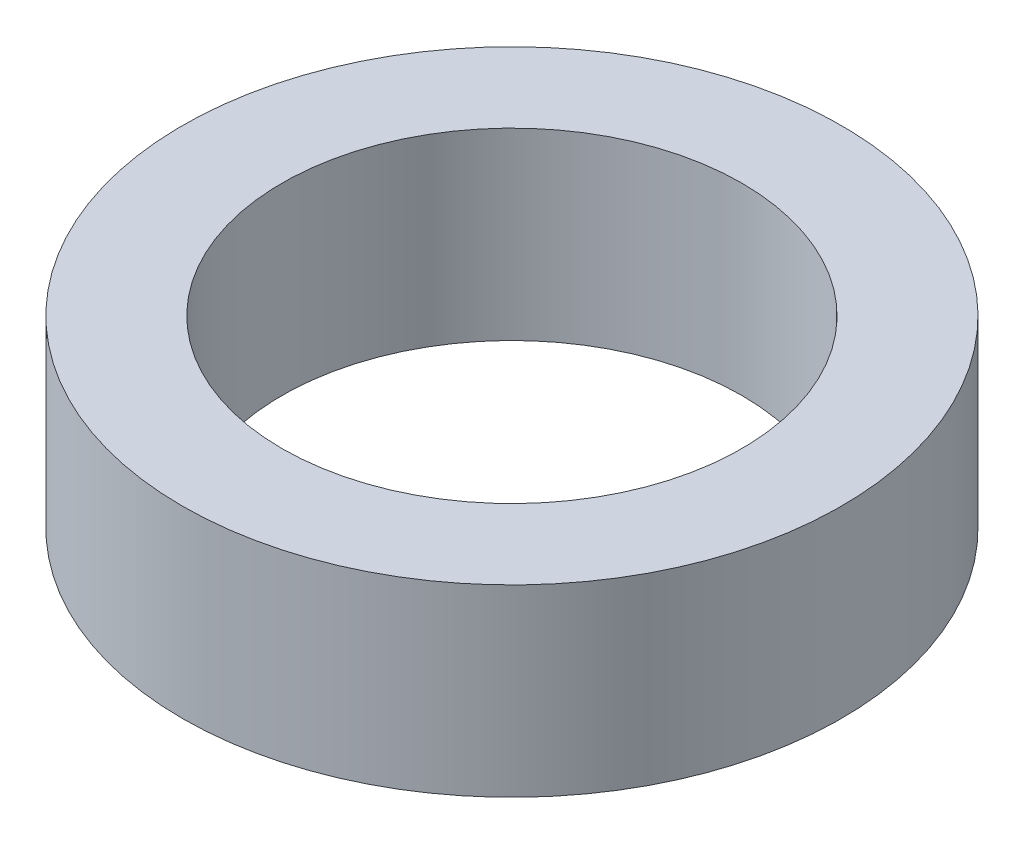
ISO-10303-21;
HEADER;
FILE_DESCRIPTION(('STEP AP214'),'2;1');
FILE_NAME('part.step','',(''),(''),'','','');
FILE_SCHEMA(('AUTOMOTIVE_DESIGN { 1 0 10303 214 1 1 1 1 }'));
ENDSEC;
DATA;
#1=APPLICATION_CONTEXT('core data for automotive mechanical design processes');
#2=APPLICATION_PROTOCOL_DEFINITION('international standard','automotive_design',2000,#1);
#3=PRODUCT_CONTEXT('',#1,'mechanical');
#4=PRODUCT('Part','Part','',(#3));
#5=PRODUCT_RELATED_PRODUCT_CATEGORY('part','',(#4));
#6=PRODUCT_DEFINITION_FORMATION('','',#4);
#7=PRODUCT_DEFINITION_CONTEXT('part definition',#1,'design');
#8=PRODUCT_DEFINITION('design','',#6,#7);
#9=PRODUCT_DEFINITION_SHAPE('','',#8);
#10=(LENGTH_UNIT() NAMED_UNIT(*) SI_UNIT(.MILLI.,.METRE.));
#11=(NAMED_UNIT(*) PLANE_ANGLE_UNIT() SI_UNIT($,.RADIAN.));
#12=(NAMED_UNIT(*) SI_UNIT($,.STERADIAN.) SOLID_ANGLE_UNIT());
#13=UNCERTAINTY_MEASURE_WITH_UNIT(LENGTH_MEASURE(1.E-05),#10,'distance_accuracy_value','');
#14=(GEOMETRIC_REPRESENTATION_CONTEXT(3) GLOBAL_UNCERTAINTY_ASSIGNED_CONTEXT((#13)) GLOBAL_UNIT_ASSIGNED_CONTEXT((#10,
#11,#12)) REPRESENTATION_CONTEXT('',''));
#15=CARTESIAN_POINT('',(0.,0.,0.));
#16=DIRECTION('',(0.,0.,1.));
#17=DIRECTION('',(1.,0.,0.));
#18=AXIS2_PLACEMENT_3D('',#15,#16,#17);
#19=CARTESIAN_POINT('',(0.,12.,0.));
#20=DIRECTION('',(0.,1.,0.));
#21=DIRECTION('',(0.,0.,1.));
#22=AXIS2_PLACEMENT_3D('',#19,#20,#21);
#23=PLANE('',#22);
#24=CARTESIAN_POINT('',(0.,12.,0.));
#25=DIRECTION('',(0.,1.,0.));
#26=DIRECTION('',(0.,0.,1.));
#27=AXIS2_PLACEMENT_3D('',#24,#25,#26);
#28=CIRCLE('',#27,21.5);
#29=CARTESIAN_POINT('',(0.,12.,21.5));
#30=VERTEX_POINT('',#29);
#31=EDGE_CURVE('E10',#30,#30,#28,.T.);
#32=ORIENTED_EDGE('',*,*,#31,.T.);
#33=EDGE_LOOP('',(#32));
#34=FACE_BOUND('',#33,.T.);
#35=CARTESIAN_POINT('',(0.,12.,0.));
#36=DIRECTION('',(0.,1.,0.));
#37=DIRECTION('',(0.,0.,1.));
#38=AXIS2_PLACEMENT_3D('',#35,#36,#37);
#39=CIRCLE('',#38,15.);
#40=CARTESIAN_POINT('',(0.,12.,15.));
#41=VERTEX_POINT('',#40);
#42=EDGE_CURVE('E43',#41,#41,#39,.T.);
#43=ORIENTED_EDGE('',*,*,#42,.F.);
#44=EDGE_LOOP('',(#43));
#45=FACE_BOUND('',#44,.T.);
#46=ADVANCED_FACE('F32',(#34,#45),#23,.T.);
#47=CARTESIAN_POINT('',(0.,0.,0.));
#48=DIRECTION('',(0.,1.,0.));
#49=DIRECTION('',(0.,0.,1.));
#50=AXIS2_PLACEMENT_3D('',#47,#48,#49);
#51=PLANE('',#50);
#52=CARTESIAN_POINT('',(0.,0.,0.));
#53=DIRECTION('',(0.,1.,0.));
#54=DIRECTION('',(0.,0.,1.));
#55=AXIS2_PLACEMENT_3D('',#52,#53,#54);
#56=CIRCLE('',#55,21.5);
#57=CARTESIAN_POINT('',(0.,0.,21.5));
#58=VERTEX_POINT('',#57);
#59=EDGE_CURVE('E36',#58,#58,#56,.T.);
#60=ORIENTED_EDGE('',*,*,#59,.F.);
#61=EDGE_LOOP('',(#60));
#62=FACE_BOUND('',#61,.T.);
#63=CARTESIAN_POINT('',(0.,0.,0.));
#64=DIRECTION('',(0.,1.,0.));
#65=DIRECTION('',(0.,0.,1.));
#66=AXIS2_PLACEMENT_3D('',#63,#64,#65);
#67=CIRCLE('',#66,15.);
#68=CARTESIAN_POINT('',(0.,0.,15.));
#69=VERTEX_POINT('',#68);
#70=EDGE_CURVE('E45',#69,#69,#67,.T.);
#71=ORIENTED_EDGE('',*,*,#70,.T.);
#72=EDGE_LOOP('',(#71));
#73=FACE_BOUND('',#72,.T.);
#74=ADVANCED_FACE('F55',(#62,#73),#51,.F.);
#75=CARTESIAN_POINT('',(0.,12.,0.));
#76=DIRECTION('',(0.,-1.,0.));
#77=DIRECTION('',(0.,0.,-1.));
#78=AXIS2_PLACEMENT_3D('',#75,#76,#77);
#79=CYLINDRICAL_SURFACE('',#78,21.5);
#80=ORIENTED_EDGE('',*,*,#31,.F.);
#81=EDGE_LOOP('',(#80));
#82=FACE_BOUND('',#81,.T.);
#83=ORIENTED_EDGE('',*,*,#59,.T.);
#84=EDGE_LOOP('',(#83));
#85=FACE_BOUND('',#84,.T.);
#86=ADVANCED_FACE('F34',(#82,#85),#79,.T.);
#87=CARTESIAN_POINT('',(0.,12.,0.));
#88=DIRECTION('',(0.,-1.,0.));
#89=DIRECTION('',(0.,0.,-1.));
#90=AXIS2_PLACEMENT_3D('',#87,#88,#89);
#91=CYLINDRICAL_SURFACE('',#90,15.);
#92=ORIENTED_EDGE('',*,*,#42,.T.);
#93=EDGE_LOOP('',(#92));
#94=FACE_BOUND('',#93,.T.);
#95=ORIENTED_EDGE('',*,*,#70,.F.);
#96=EDGE_LOOP('',(#95));
#97=FACE_BOUND('',#96,.T.);
#98=ADVANCED_FACE('F51',(#94,#97),#91,.F.);
#99=CLOSED_SHELL('',(#46,#74,#86,#98));
#100=MANIFOLD_SOLID_BREP('B2',#99);
#101=ADVANCED_BREP_SHAPE_REPRESENTATION('',(#18,#100),#14);
#102=SHAPE_DEFINITION_REPRESENTATION(#9,#101);
ENDSEC;
END-ISO-10303-21;
